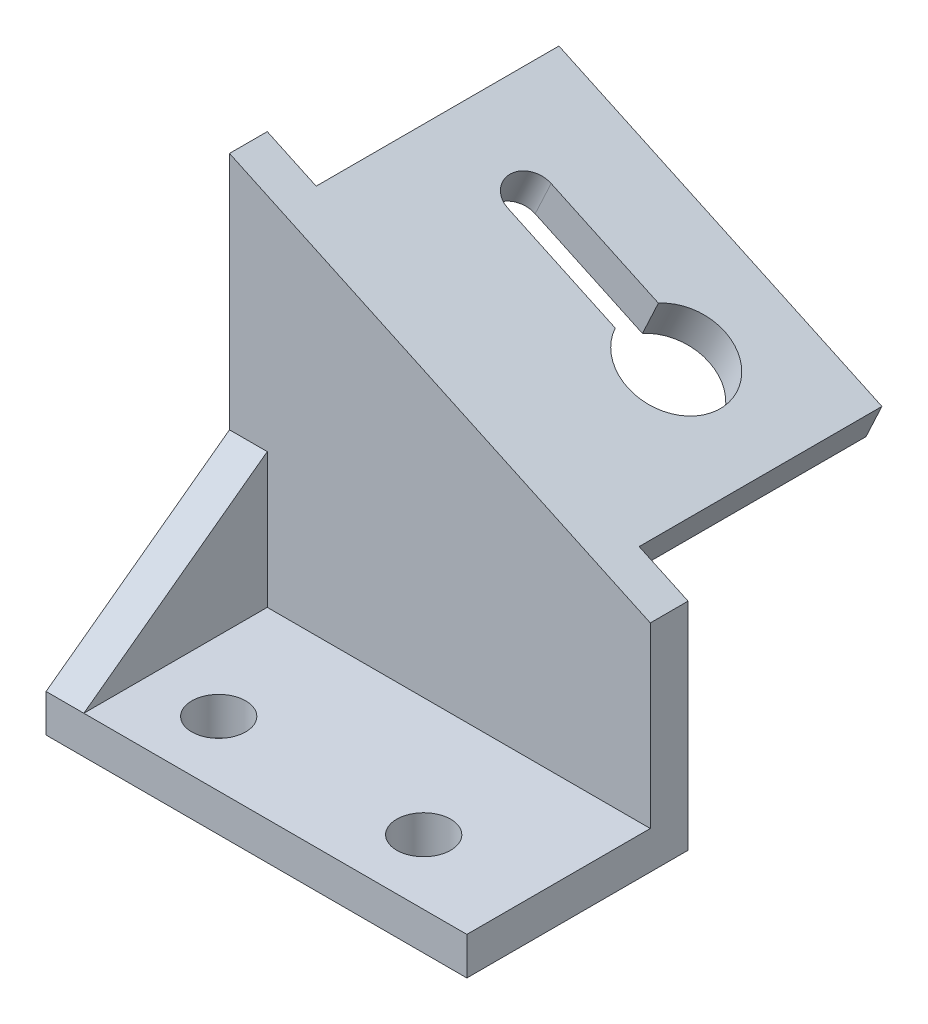
ISO-10303-21;
HEADER;
FILE_DESCRIPTION(('STEP AP214'),'2;1');
FILE_NAME('part.step','',(''),(''),'','','');
FILE_SCHEMA(('AUTOMOTIVE_DESIGN { 1 0 10303 214 1 1 1 1 }'));
ENDSEC;
DATA;
#1=APPLICATION_CONTEXT('core data for automotive mechanical design processes');
#2=APPLICATION_PROTOCOL_DEFINITION('international standard','automotive_design',2000,#1);
#3=PRODUCT_CONTEXT('',#1,'mechanical');
#4=PRODUCT('Part','Part','',(#3));
#5=PRODUCT_RELATED_PRODUCT_CATEGORY('part','',(#4));
#6=PRODUCT_DEFINITION_FORMATION('','',#4);
#7=PRODUCT_DEFINITION_CONTEXT('part definition',#1,'design');
#8=PRODUCT_DEFINITION('design','',#6,#7);
#9=PRODUCT_DEFINITION_SHAPE('','',#8);
#10=(LENGTH_UNIT() NAMED_UNIT(*) SI_UNIT(.MILLI.,.METRE.));
#11=(NAMED_UNIT(*) PLANE_ANGLE_UNIT() SI_UNIT($,.RADIAN.));
#12=(NAMED_UNIT(*) SI_UNIT($,.STERADIAN.) SOLID_ANGLE_UNIT());
#13=UNCERTAINTY_MEASURE_WITH_UNIT(LENGTH_MEASURE(1.E-05),#10,'distance_accuracy_value','');
#14=(GEOMETRIC_REPRESENTATION_CONTEXT(3) GLOBAL_UNCERTAINTY_ASSIGNED_CONTEXT((#13)) GLOBAL_UNIT_ASSIGNED_CONTEXT((#10,
#11,#12)) REPRESENTATION_CONTEXT('',''));
#15=CARTESIAN_POINT('',(0.,0.,0.));
#16=DIRECTION('',(0.,0.,1.));
#17=DIRECTION('',(1.,0.,0.));
#18=AXIS2_PLACEMENT_3D('',#15,#16,#17);
#19=CARTESIAN_POINT('',(0.,7.,-41.));
#20=DIRECTION('',(0.,0.,1.));
#21=DIRECTION('',(1.,0.,0.));
#22=AXIS2_PLACEMENT_3D('',#19,#20,#21);
#23=PLANE('',#22);
#24=DIRECTION('',(0.422618261740693,0.906307787036653,0.));
#25=VECTOR('',#24,1.);
#26=CARTESIAN_POINT('',(6.10475003818169,65.8016602094257,-41.));
#27=LINE('',#26,#25);
#28=CARTESIAN_POINT('',(6.10475003818169,65.8016602094257,-41.));
#29=VERTEX_POINT('',#28);
#30=CARTESIAN_POINT('',(9.06307787036654,72.1458147186823,-41.));
#31=VERTEX_POINT('',#30);
#32=EDGE_CURVE('E229',#29,#31,#27,.T.);
#33=ORIENTED_EDGE('',*,*,#32,.F.);
#34=DIRECTION('',(0.906307787036653,-0.422618261740693,0.));
#35=VECTOR('',#34,1.);
#36=CARTESIAN_POINT('',(6.10475003818169,65.8016602094257,-41.));
#37=LINE('',#36,#35);
#38=CARTESIAN_POINT('',(65.9785942974486,37.8820281081504,-41.));
#39=VERTEX_POINT('',#38);
#40=EDGE_CURVE('E216',#29,#39,#37,.T.);
#41=ORIENTED_EDGE('',*,*,#40,.T.);
#42=DIRECTION('',(0.422618261740693,0.906307787036653,0.));
#43=VECTOR('',#42,1.);
#44=CARTESIAN_POINT('',(65.9785942974486,37.8820281081504,-41.));
#45=LINE('',#44,#43);
#46=CARTESIAN_POINT('',(68.9369221296334,44.2261826174069,-41.));
#47=VERTEX_POINT('',#46);
#48=EDGE_CURVE('E244',#39,#47,#45,.T.);
#49=ORIENTED_EDGE('',*,*,#48,.T.);
#50=DIRECTION('',(0.906307787036653,-0.422618261740693,0.));
#51=VECTOR('',#50,1.);
#52=CARTESIAN_POINT('',(0.,76.3719973360892,-41.));
#53=LINE('',#52,#51);
#54=CARTESIAN_POINT('',(78.,40.,-41.));
#55=VERTEX_POINT('',#54);
#56=EDGE_CURVE('E263',#47,#55,#53,.T.);
#57=ORIENTED_EDGE('',*,*,#56,.T.);
#58=DIRECTION('',(0.,-1.,0.));
#59=VECTOR('',#58,1.);
#60=CARTESIAN_POINT('',(78.,7.,-41.));
#61=LINE('',#60,#59);
#62=CARTESIAN_POINT('',(78.,0.,-41.));
#63=VERTEX_POINT('',#62);
#64=EDGE_CURVE('E333',#55,#63,#61,.T.);
#65=ORIENTED_EDGE('',*,*,#64,.T.);
#66=DIRECTION('',(-1.,0.,0.));
#67=VECTOR('',#66,1.);
#68=CARTESIAN_POINT('',(0.,0.,-41.));
#69=LINE('',#68,#67);
#70=CARTESIAN_POINT('',(0.,0.,-41.));
#71=VERTEX_POINT('',#70);
#72=EDGE_CURVE('E327',#63,#71,#69,.T.);
#73=ORIENTED_EDGE('',*,*,#72,.T.);
#74=DIRECTION('',(0.,-1.,0.));
#75=VECTOR('',#74,1.);
#76=CARTESIAN_POINT('',(0.,7.,-41.));
#77=LINE('',#76,#75);
#78=CARTESIAN_POINT('',(0.,76.3719973360892,-41.));
#79=VERTEX_POINT('',#78);
#80=EDGE_CURVE('E317',#79,#71,#77,.T.);
#81=ORIENTED_EDGE('',*,*,#80,.F.);
#82=EDGE_CURVE('E269',#79,#31,#53,.T.);
#83=ORIENTED_EDGE('',*,*,#82,.T.);
#84=EDGE_LOOP('',(#33,#41,#49,#57,#65,#73,#81,#83));
#85=FACE_BOUND('',#84,.T.);
#86=ADVANCED_FACE('F45',(#85),#23,.F.);
#87=CARTESIAN_POINT('',(0.,0.,-34.));
#88=DIRECTION('',(0.,0.,-1.));
#89=DIRECTION('',(-1.,0.,0.));
#90=AXIS2_PLACEMENT_3D('',#87,#88,#89);
#91=PLANE('',#90);
#92=DIRECTION('',(-1.,0.,0.));
#93=VECTOR('',#92,1.);
#94=CARTESIAN_POINT('',(7.,32.,-34.));
#95=LINE('',#94,#93);
#96=CARTESIAN_POINT('',(7.,32.,-34.));
#97=VERTEX_POINT('',#96);
#98=CARTESIAN_POINT('',(0.,32.,-34.));
#99=VERTEX_POINT('',#98);
#100=EDGE_CURVE('E258',#97,#99,#95,.T.);
#101=ORIENTED_EDGE('',*,*,#100,.F.);
#102=DIRECTION('',(0.,1.,0.));
#103=VECTOR('',#102,1.);
#104=CARTESIAN_POINT('',(7.,7.,-34.));
#105=LINE('',#104,#103);
#106=CARTESIAN_POINT('',(7.,7.,-34.));
#107=VERTEX_POINT('',#106);
#108=EDGE_CURVE('E252',#107,#97,#105,.T.);
#109=ORIENTED_EDGE('',*,*,#108,.F.);
#110=DIRECTION('',(-1.,0.,0.));
#111=VECTOR('',#110,1.);
#112=CARTESIAN_POINT('',(78.,7.,-34.));
#113=LINE('',#112,#111);
#114=CARTESIAN_POINT('',(78.,7.,-34.));
#115=VERTEX_POINT('',#114);
#116=EDGE_CURVE('E268',#115,#107,#113,.T.);
#117=ORIENTED_EDGE('',*,*,#116,.F.);
#118=DIRECTION('',(0.,-1.,0.));
#119=VECTOR('',#118,1.);
#120=CARTESIAN_POINT('',(78.,40.,-34.));
#121=LINE('',#120,#119);
#122=CARTESIAN_POINT('',(78.,40.,-34.));
#123=VERTEX_POINT('',#122);
#124=EDGE_CURVE('E264',#123,#115,#121,.T.);
#125=ORIENTED_EDGE('',*,*,#124,.F.);
#126=DIRECTION('',(0.906307787036653,-0.422618261740693,0.));
#127=VECTOR('',#126,1.);
#128=CARTESIAN_POINT('',(0.,76.3719973360892,-34.));
#129=LINE('',#128,#127);
#130=CARTESIAN_POINT('',(0.,76.3719973360892,-34.));
#131=VERTEX_POINT('',#130);
#132=EDGE_CURVE('E276',#131,#123,#129,.T.);
#133=ORIENTED_EDGE('',*,*,#132,.F.);
#134=DIRECTION('',(0.,1.,0.));
#135=VECTOR('',#134,1.);
#136=CARTESIAN_POINT('',(0.,7.,-34.));
#137=LINE('',#136,#135);
#138=EDGE_CURVE('E273',#99,#131,#137,.T.);
#139=ORIENTED_EDGE('',*,*,#138,.F.);
#140=EDGE_LOOP('',(#101,#109,#117,#125,#133,#139));
#141=FACE_BOUND('',#140,.T.);
#142=ADVANCED_FACE('F385',(#141),#91,.F.);
#143=CARTESIAN_POINT('',(0.,7.,0.));
#144=DIRECTION('',(0.,-1.,0.));
#145=DIRECTION('',(0.,0.,-1.));
#146=AXIS2_PLACEMENT_3D('',#143,#144,#145);
#147=PLANE('',#146);
#148=ORIENTED_EDGE('',*,*,#116,.T.);
#149=DIRECTION('',(0.,0.,-1.));
#150=VECTOR('',#149,1.);
#151=CARTESIAN_POINT('',(7.,7.,0.));
#152=LINE('',#151,#150);
#153=CARTESIAN_POINT('',(7.,7.,0.));
#154=VERTEX_POINT('',#153);
#155=EDGE_CURVE('E249',#154,#107,#152,.T.);
#156=ORIENTED_EDGE('',*,*,#155,.F.);
#157=DIRECTION('',(1.,0.,0.));
#158=VECTOR('',#157,1.);
#159=CARTESIAN_POINT('',(0.,7.,0.));
#160=LINE('',#159,#158);
#161=CARTESIAN_POINT('',(78.,7.,0.));
#162=VERTEX_POINT('',#161);
#163=EDGE_CURVE('E313',#154,#162,#160,.T.);
#164=ORIENTED_EDGE('',*,*,#163,.T.);
#165=DIRECTION('',(0.,0.,-1.));
#166=VECTOR('',#165,1.);
#167=CARTESIAN_POINT('',(78.,7.,0.));
#168=LINE('',#167,#166);
#169=EDGE_CURVE('E312',#162,#115,#168,.T.);
#170=ORIENTED_EDGE('',*,*,#169,.T.);
#171=EDGE_LOOP('',(#148,#156,#164,#170));
#172=FACE_BOUND('',#171,.T.);
#173=CARTESIAN_POINT('',(20.,7.,-12.));
#174=DIRECTION('',(0.,1.,0.));
#175=DIRECTION('',(0.,0.,1.));
#176=AXIS2_PLACEMENT_3D('',#173,#174,#175);
#177=CIRCLE('',#176,5.);
#178=CARTESIAN_POINT('',(20.,7.,-7.));
#179=VERTEX_POINT('',#178);
#180=EDGE_CURVE('E300',#179,#179,#177,.T.);
#181=ORIENTED_EDGE('',*,*,#180,.F.);
#182=EDGE_LOOP('',(#181));
#183=FACE_BOUND('',#182,.T.);
#184=CARTESIAN_POINT('',(58.,7.,-12.));
#185=DIRECTION('',(0.,1.,0.));
#186=DIRECTION('',(0.,0.,1.));
#187=AXIS2_PLACEMENT_3D('',#184,#185,#186);
#188=CIRCLE('',#187,5.);
#189=CARTESIAN_POINT('',(58.,7.,-7.));
#190=VERTEX_POINT('',#189);
#191=EDGE_CURVE('E292',#190,#190,#188,.T.);
#192=ORIENTED_EDGE('',*,*,#191,.F.);
#193=EDGE_LOOP('',(#192));
#194=FACE_BOUND('',#193,.T.);
#195=ADVANCED_FACE('F375',(#172,#183,#194),#147,.F.);
#196=CARTESIAN_POINT('',(0.,0.,0.));
#197=DIRECTION('',(0.,-1.,0.));
#198=DIRECTION('',(0.,0.,-1.));
#199=AXIS2_PLACEMENT_3D('',#196,#197,#198);
#200=PLANE('',#199);
#201=CARTESIAN_POINT('',(20.,0.,-12.));
#202=DIRECTION('',(0.,1.,0.));
#203=DIRECTION('',(0.,0.,1.));
#204=AXIS2_PLACEMENT_3D('',#201,#202,#203);
#205=CIRCLE('',#204,5.);
#206=CARTESIAN_POINT('',(20.,0.,-7.));
#207=VERTEX_POINT('',#206);
#208=EDGE_CURVE('E296',#207,#207,#205,.T.);
#209=ORIENTED_EDGE('',*,*,#208,.T.);
#210=EDGE_LOOP('',(#209));
#211=FACE_BOUND('',#210,.T.);
#212=DIRECTION('',(0.,0.,1.));
#213=VECTOR('',#212,1.);
#214=CARTESIAN_POINT('',(0.,0.,0.));
#215=LINE('',#214,#213);
#216=CARTESIAN_POINT('',(0.,0.,0.));
#217=VERTEX_POINT('',#216);
#218=EDGE_CURVE('E304',#71,#217,#215,.T.);
#219=ORIENTED_EDGE('',*,*,#218,.F.);
#220=ORIENTED_EDGE('',*,*,#72,.F.);
#221=DIRECTION('',(0.,0.,-1.));
#222=VECTOR('',#221,1.);
#223=CARTESIAN_POINT('',(78.,0.,0.));
#224=LINE('',#223,#222);
#225=CARTESIAN_POINT('',(78.,0.,0.));
#226=VERTEX_POINT('',#225);
#227=EDGE_CURVE('E324',#226,#63,#224,.T.);
#228=ORIENTED_EDGE('',*,*,#227,.F.);
#229=DIRECTION('',(1.,0.,0.));
#230=VECTOR('',#229,1.);
#231=CARTESIAN_POINT('',(0.,0.,0.));
#232=LINE('',#231,#230);
#233=EDGE_CURVE('E321',#217,#226,#232,.T.);
#234=ORIENTED_EDGE('',*,*,#233,.F.);
#235=EDGE_LOOP('',(#219,#220,#228,#234));
#236=FACE_BOUND('',#235,.T.);
#237=CARTESIAN_POINT('',(58.,0.,-12.));
#238=DIRECTION('',(0.,1.,0.));
#239=DIRECTION('',(0.,0.,1.));
#240=AXIS2_PLACEMENT_3D('',#237,#238,#239);
#241=CIRCLE('',#240,5.);
#242=CARTESIAN_POINT('',(58.,0.,-7.));
#243=VERTEX_POINT('',#242);
#244=EDGE_CURVE('E288',#243,#243,#241,.T.);
#245=ORIENTED_EDGE('',*,*,#244,.T.);
#246=EDGE_LOOP('',(#245));
#247=FACE_BOUND('',#246,.T.);
#248=ADVANCED_FACE('F349',(#211,#236,#247),#200,.T.);
#249=CARTESIAN_POINT('',(0.,7.,0.));
#250=DIRECTION('',(1.,0.,0.));
#251=DIRECTION('',(0.,0.,-1.));
#252=AXIS2_PLACEMENT_3D('',#249,#250,#251);
#253=PLANE('',#252);
#254=DIRECTION('',(0.,-1.,0.));
#255=VECTOR('',#254,1.);
#256=CARTESIAN_POINT('',(0.,7.,0.));
#257=LINE('',#256,#255);
#258=CARTESIAN_POINT('',(0.,7.,0.));
#259=VERTEX_POINT('',#258);
#260=EDGE_CURVE('E11',#259,#217,#257,.T.);
#261=ORIENTED_EDGE('',*,*,#260,.F.);
#262=DIRECTION('',(0.,-0.592390450477518,0.805651012649425));
#263=VECTOR('',#262,1.);
#264=CARTESIAN_POINT('',(0.,32.,-34.));
#265=LINE('',#264,#263);
#266=EDGE_CURVE('E69',#99,#259,#265,.T.);
#267=ORIENTED_EDGE('',*,*,#266,.F.);
#268=ORIENTED_EDGE('',*,*,#138,.T.);
#269=DIRECTION('',(0.,0.,-1.));
#270=VECTOR('',#269,1.);
#271=CARTESIAN_POINT('',(0.,76.3719973360892,-34.));
#272=LINE('',#271,#270);
#273=EDGE_CURVE('E280',#131,#79,#272,.T.);
#274=ORIENTED_EDGE('',*,*,#273,.T.);
#275=ORIENTED_EDGE('',*,*,#80,.T.);
#276=ORIENTED_EDGE('',*,*,#218,.T.);
#277=EDGE_LOOP('',(#261,#267,#268,#274,#275,#276));
#278=FACE_BOUND('',#277,.T.);
#279=ADVANCED_FACE('F47',(#278),#253,.F.);
#280=CARTESIAN_POINT('',(0.,7.,0.));
#281=DIRECTION('',(0.,0.,-1.));
#282=DIRECTION('',(-1.,0.,0.));
#283=AXIS2_PLACEMENT_3D('',#280,#281,#282);
#284=PLANE('',#283);
#285=ORIENTED_EDGE('',*,*,#233,.T.);
#286=DIRECTION('',(0.,-1.,0.));
#287=VECTOR('',#286,1.);
#288=CARTESIAN_POINT('',(78.,7.,0.));
#289=LINE('',#288,#287);
#290=EDGE_CURVE('E54',#162,#226,#289,.T.);
#291=ORIENTED_EDGE('',*,*,#290,.F.);
#292=ORIENTED_EDGE('',*,*,#163,.F.);
#293=EDGE_CURVE('E308',#259,#154,#160,.T.);
#294=ORIENTED_EDGE('',*,*,#293,.F.);
#295=ORIENTED_EDGE('',*,*,#260,.T.);
#296=EDGE_LOOP('',(#285,#291,#292,#294,#295));
#297=FACE_BOUND('',#296,.T.);
#298=ADVANCED_FACE('F378',(#297),#284,.F.);
#299=CARTESIAN_POINT('',(78.,7.,0.));
#300=DIRECTION('',(-1.,0.,0.));
#301=DIRECTION('',(0.,0.,1.));
#302=AXIS2_PLACEMENT_3D('',#299,#300,#301);
#303=PLANE('',#302);
#304=ORIENTED_EDGE('',*,*,#227,.T.);
#305=ORIENTED_EDGE('',*,*,#64,.F.);
#306=DIRECTION('',(0.,0.,-1.));
#307=VECTOR('',#306,1.);
#308=CARTESIAN_POINT('',(78.,40.,-34.));
#309=LINE('',#308,#307);
#310=EDGE_CURVE('E284',#123,#55,#309,.T.);
#311=ORIENTED_EDGE('',*,*,#310,.F.);
#312=ORIENTED_EDGE('',*,*,#124,.T.);
#313=ORIENTED_EDGE('',*,*,#169,.F.);
#314=ORIENTED_EDGE('',*,*,#290,.T.);
#315=EDGE_LOOP('',(#304,#305,#311,#312,#313,#314));
#316=FACE_BOUND('',#315,.T.);
#317=ADVANCED_FACE('F342',(#316),#303,.F.);
#318=CARTESIAN_POINT('',(20.,7.,-12.));
#319=DIRECTION('',(0.,-1.,0.));
#320=DIRECTION('',(0.,0.,-1.));
#321=AXIS2_PLACEMENT_3D('',#318,#319,#320);
#322=CYLINDRICAL_SURFACE('',#321,5.);
#323=ORIENTED_EDGE('',*,*,#180,.T.);
#324=EDGE_LOOP('',(#323));
#325=FACE_BOUND('',#324,.T.);
#326=ORIENTED_EDGE('',*,*,#208,.F.);
#327=EDGE_LOOP('',(#326));
#328=FACE_BOUND('',#327,.T.);
#329=ADVANCED_FACE('F408',(#325,#328),#322,.F.);
#330=CARTESIAN_POINT('',(58.,7.,-12.));
#331=DIRECTION('',(0.,-1.,0.));
#332=DIRECTION('',(0.,0.,-1.));
#333=AXIS2_PLACEMENT_3D('',#330,#331,#332);
#334=CYLINDRICAL_SURFACE('',#333,5.);
#335=ORIENTED_EDGE('',*,*,#191,.T.);
#336=EDGE_LOOP('',(#335));
#337=FACE_BOUND('',#336,.T.);
#338=ORIENTED_EDGE('',*,*,#244,.F.);
#339=EDGE_LOOP('',(#338));
#340=FACE_BOUND('',#339,.T.);
#341=ADVANCED_FACE('F423',(#337,#340),#334,.F.);
#342=CARTESIAN_POINT('',(0.,76.3719973360892,-34.));
#343=DIRECTION('',(0.422618261740693,0.906307787036653,0.));
#344=DIRECTION('',(-0.906307787036653,0.422618261740693,0.));
#345=AXIS2_PLACEMENT_3D('',#342,#343,#344);
#346=PLANE('',#345);
#347=ORIENTED_EDGE('',*,*,#82,.F.);
#348=ORIENTED_EDGE('',*,*,#273,.F.);
#349=ORIENTED_EDGE('',*,*,#132,.T.);
#350=ORIENTED_EDGE('',*,*,#310,.T.);
#351=ORIENTED_EDGE('',*,*,#56,.F.);
#352=DIRECTION('',(0.,0.,-1.));
#353=VECTOR('',#352,1.);
#354=CARTESIAN_POINT('',(68.9369221296335,44.226182617407,-41.));
#355=LINE('',#354,#353);
#356=CARTESIAN_POINT('',(68.9369221296335,44.226182617407,-86.));
#357=VERTEX_POINT('',#356);
#358=EDGE_CURVE('E61',#47,#357,#355,.T.);
#359=ORIENTED_EDGE('',*,*,#358,.T.);
#360=DIRECTION('',(-0.906307787036653,0.422618261740693,0.));
#361=VECTOR('',#360,1.);
#362=CARTESIAN_POINT('',(9.06307787036654,72.1458147186823,-86.));
#363=LINE('',#362,#361);
#364=CARTESIAN_POINT('',(9.06307787036654,72.1458147186823,-86.));
#365=VERTEX_POINT('',#364);
#366=EDGE_CURVE('E217',#357,#365,#363,.T.);
#367=ORIENTED_EDGE('',*,*,#366,.T.);
#368=DIRECTION('',(0.,0.,1.));
#369=VECTOR('',#368,1.);
#370=CARTESIAN_POINT('',(9.06307787036654,72.1458147186823,-41.));
#371=LINE('',#370,#369);
#372=EDGE_CURVE('E206',#365,#31,#371,.T.);
#373=ORIENTED_EDGE('',*,*,#372,.T.);
#374=EDGE_LOOP('',(#347,#348,#349,#350,#351,#359,#367,#373));
#375=FACE_BOUND('',#374,.T.);
#376=DIRECTION('',(0.906307787036653,-0.422618261740693,0.));
#377=VECTOR('',#376,1.);
#378=CARTESIAN_POINT('',(23.6215327778008,65.3570957044416,-62.));
#379=LINE('',#378,#377);
#380=CARTESIAN_POINT('',(23.6215327778008,65.3570957044416,-62.));
#381=VERTEX_POINT('',#380);
#382=CARTESIAN_POINT('',(43.5038794105208,56.0858052075122,-62.));
#383=VERTEX_POINT('',#382);
#384=EDGE_CURVE('E197',#381,#383,#379,.T.);
#385=ORIENTED_EDGE('',*,*,#384,.F.);
#386=CARTESIAN_POINT('',(23.6215327778008,65.3570957044416,-66.));
#387=DIRECTION('',(0.422618261740693,0.906307787036653,0.));
#388=DIRECTION('',(-0.906307787036653,0.422618261740693,0.));
#389=AXIS2_PLACEMENT_3D('',#386,#387,#388);
#390=CIRCLE('',#389,4.);
#391=CARTESIAN_POINT('',(23.6215327778008,65.3570957044416,-70.));
#392=VERTEX_POINT('',#391);
#393=EDGE_CURVE('E163',#392,#381,#390,.T.);
#394=ORIENTED_EDGE('',*,*,#393,.F.);
#395=DIRECTION('',(-0.906307787036653,0.422618261740693,0.));
#396=VECTOR('',#395,1.);
#397=CARTESIAN_POINT('',(23.6215327778008,65.3570957044416,-70.));
#398=LINE('',#397,#396);
#399=CARTESIAN_POINT('',(43.5038794105208,56.0858052075122,-70.));
#400=VERTEX_POINT('',#399);
#401=EDGE_CURVE('E184',#400,#392,#398,.T.);
#402=ORIENTED_EDGE('',*,*,#401,.F.);
#403=CARTESIAN_POINT('',(50.8107663889004,52.6785478522208,-66.));
#404=DIRECTION('',(0.422618261740693,0.906307787036653,0.));
#405=DIRECTION('',(-0.906307787036653,0.422618261740693,0.));
#406=AXIS2_PLACEMENT_3D('',#403,#404,#405);
#407=CIRCLE('',#406,9.);
#408=EDGE_CURVE('E188',#383,#400,#407,.T.);
#409=ORIENTED_EDGE('',*,*,#408,.F.);
#410=EDGE_LOOP('',(#385,#394,#402,#409));
#411=FACE_BOUND('',#410,.T.);
#412=ADVANCED_FACE('F358',(#375,#411),#346,.T.);
#413=CARTESIAN_POINT('',(7.,32.,-34.));
#414=DIRECTION('',(0.,-0.805651012649425,-0.592390450477518));
#415=DIRECTION('',(0.,0.592390450477518,-0.805651012649425));
#416=AXIS2_PLACEMENT_3D('',#413,#414,#415);
#417=PLANE('',#416);
#418=ORIENTED_EDGE('',*,*,#266,.T.);
#419=ORIENTED_EDGE('',*,*,#293,.T.);
#420=DIRECTION('',(0.,-0.592390450477518,0.805651012649425));
#421=VECTOR('',#420,1.);
#422=CARTESIAN_POINT('',(7.,32.,-34.));
#423=LINE('',#422,#421);
#424=EDGE_CURVE('E255',#97,#154,#423,.T.);
#425=ORIENTED_EDGE('',*,*,#424,.F.);
#426=ORIENTED_EDGE('',*,*,#100,.T.);
#427=EDGE_LOOP('',(#418,#419,#425,#426));
#428=FACE_BOUND('',#427,.T.);
#429=ADVANCED_FACE('F381',(#428),#417,.F.);
#430=CARTESIAN_POINT('',(7.,0.,0.));
#431=DIRECTION('',(1.,0.,0.));
#432=DIRECTION('',(0.,0.,-1.));
#433=AXIS2_PLACEMENT_3D('',#430,#431,#432);
#434=PLANE('',#433);
#435=ORIENTED_EDGE('',*,*,#155,.T.);
#436=ORIENTED_EDGE('',*,*,#108,.T.);
#437=ORIENTED_EDGE('',*,*,#424,.T.);
#438=EDGE_LOOP('',(#435,#436,#437));
#439=FACE_BOUND('',#438,.T.);
#440=ADVANCED_FACE('F388',(#439),#434,.T.);
#441=CARTESIAN_POINT('',(6.10475003818169,65.8016602094257,-41.));
#442=DIRECTION('',(-0.906307787036653,0.422618261740693,0.));
#443=DIRECTION('',(-0.422618261740693,-0.906307787036653,0.));
#444=AXIS2_PLACEMENT_3D('',#441,#442,#443);
#445=PLANE('',#444);
#446=ORIENTED_EDGE('',*,*,#372,.F.);
#447=DIRECTION('',(0.422618261740693,0.906307787036653,0.));
#448=VECTOR('',#447,1.);
#449=CARTESIAN_POINT('',(6.10475003818169,65.8016602094257,-86.));
#450=LINE('',#449,#448);
#451=CARTESIAN_POINT('',(6.10475003818169,65.8016602094257,-86.));
#452=VERTEX_POINT('',#451);
#453=EDGE_CURVE('E238',#452,#365,#450,.T.);
#454=ORIENTED_EDGE('',*,*,#453,.F.);
#455=DIRECTION('',(0.,0.,1.));
#456=VECTOR('',#455,1.);
#457=CARTESIAN_POINT('',(6.10475003818169,65.8016602094257,-41.));
#458=LINE('',#457,#456);
#459=EDGE_CURVE('E212',#452,#29,#458,.T.);
#460=ORIENTED_EDGE('',*,*,#459,.T.);
#461=ORIENTED_EDGE('',*,*,#32,.T.);
#462=EDGE_LOOP('',(#446,#454,#460,#461));
#463=FACE_BOUND('',#462,.T.);
#464=ADVANCED_FACE('F362',(#463),#445,.T.);
#465=CARTESIAN_POINT('',(6.10475003818169,65.8016602094257,-86.));
#466=DIRECTION('',(0.,0.,-1.));
#467=DIRECTION('',(-1.,0.,0.));
#468=AXIS2_PLACEMENT_3D('',#465,#466,#467);
#469=PLANE('',#468);
#470=ORIENTED_EDGE('',*,*,#366,.F.);
#471=DIRECTION('',(0.422618261740693,0.906307787036653,0.));
#472=VECTOR('',#471,1.);
#473=CARTESIAN_POINT('',(65.9785942974486,37.8820281081504,-86.));
#474=LINE('',#473,#472);
#475=CARTESIAN_POINT('',(65.9785942974486,37.8820281081504,-86.));
#476=VERTEX_POINT('',#475);
#477=EDGE_CURVE('E241',#476,#357,#474,.T.);
#478=ORIENTED_EDGE('',*,*,#477,.F.);
#479=DIRECTION('',(-0.906307787036653,0.422618261740693,0.));
#480=VECTOR('',#479,1.);
#481=CARTESIAN_POINT('',(6.10475003818169,65.8016602094257,-86.));
#482=LINE('',#481,#480);
#483=EDGE_CURVE('E225',#476,#452,#482,.T.);
#484=ORIENTED_EDGE('',*,*,#483,.T.);
#485=ORIENTED_EDGE('',*,*,#453,.T.);
#486=EDGE_LOOP('',(#470,#478,#484,#485));
#487=FACE_BOUND('',#486,.T.);
#488=ADVANCED_FACE('F368',(#487),#469,.T.);
#489=CARTESIAN_POINT('',(65.9785942974486,37.8820281081504,-41.));
#490=DIRECTION('',(0.906307787036653,-0.422618261740693,0.));
#491=DIRECTION('',(0.422618261740693,0.906307787036653,0.));
#492=AXIS2_PLACEMENT_3D('',#489,#490,#491);
#493=PLANE('',#492);
#494=ORIENTED_EDGE('',*,*,#358,.F.);
#495=ORIENTED_EDGE('',*,*,#48,.F.);
#496=DIRECTION('',(0.,0.,-1.));
#497=VECTOR('',#496,1.);
#498=CARTESIAN_POINT('',(65.9785942974486,37.8820281081504,-41.));
#499=LINE('',#498,#497);
#500=EDGE_CURVE('E221',#39,#476,#499,.T.);
#501=ORIENTED_EDGE('',*,*,#500,.T.);
#502=ORIENTED_EDGE('',*,*,#477,.T.);
#503=EDGE_LOOP('',(#494,#495,#501,#502));
#504=FACE_BOUND('',#503,.T.);
#505=ADVANCED_FACE('F369',(#504),#493,.T.);
#506=CARTESIAN_POINT('',(26.2938442524191,56.3873309661143,0.));
#507=DIRECTION('',(-0.422618261740693,-0.906307787036653,0.));
#508=DIRECTION('',(0.906307787036653,-0.422618261740693,0.));
#509=AXIS2_PLACEMENT_3D('',#506,#507,#508);
#510=PLANE('',#509);
#511=CARTESIAN_POINT('',(20.663204945616,59.012941195185,-66.));
#512=DIRECTION('',(0.422618261740693,0.906307787036653,0.));
#513=DIRECTION('',(-0.906307787036653,0.422618261740693,0.));
#514=AXIS2_PLACEMENT_3D('',#511,#512,#513);
#515=CIRCLE('',#514,4.);
#516=CARTESIAN_POINT('',(20.663204945616,59.012941195185,-70.));
#517=VERTEX_POINT('',#516);
#518=CARTESIAN_POINT('',(20.663204945616,59.012941195185,-62.));
#519=VERTEX_POINT('',#518);
#520=EDGE_CURVE('E160',#517,#519,#515,.T.);
#521=ORIENTED_EDGE('',*,*,#520,.T.);
#522=DIRECTION('',(0.906307787036653,-0.422618261740693,0.));
#523=VECTOR('',#522,1.);
#524=CARTESIAN_POINT('',(20.663204945616,59.012941195185,-62.));
#525=LINE('',#524,#523);
#526=CARTESIAN_POINT('',(40.545551578336,49.7416506982556,-62.));
#527=VERTEX_POINT('',#526);
#528=EDGE_CURVE('E173',#519,#527,#525,.T.);
#529=ORIENTED_EDGE('',*,*,#528,.T.);
#530=CARTESIAN_POINT('',(47.8524385567156,46.3343933429643,-66.));
#531=DIRECTION('',(0.422618261740693,0.906307787036653,0.));
#532=DIRECTION('',(-0.906307787036653,0.422618261740693,0.));
#533=AXIS2_PLACEMENT_3D('',#530,#531,#532);
#534=CIRCLE('',#533,9.);
#535=CARTESIAN_POINT('',(40.545551578336,49.7416506982556,-70.));
#536=VERTEX_POINT('',#535);
#537=EDGE_CURVE('E178',#527,#536,#534,.T.);
#538=ORIENTED_EDGE('',*,*,#537,.T.);
#539=DIRECTION('',(-0.906307787036653,0.422618261740693,0.));
#540=VECTOR('',#539,1.);
#541=CARTESIAN_POINT('',(20.663204945616,59.012941195185,-70.));
#542=LINE('',#541,#540);
#543=EDGE_CURVE('E169',#536,#517,#542,.T.);
#544=ORIENTED_EDGE('',*,*,#543,.T.);
#545=EDGE_LOOP('',(#521,#529,#538,#544));
#546=FACE_BOUND('',#545,.T.);
#547=ORIENTED_EDGE('',*,*,#459,.F.);
#548=ORIENTED_EDGE('',*,*,#483,.F.);
#549=ORIENTED_EDGE('',*,*,#500,.F.);
#550=ORIENTED_EDGE('',*,*,#40,.F.);
#551=EDGE_LOOP('',(#547,#548,#549,#550));
#552=FACE_BOUND('',#551,.T.);
#553=ADVANCED_FACE('F180',(#546,#552),#510,.T.);
#554=CARTESIAN_POINT('',(20.663204945616,59.012941195185,-66.));
#555=DIRECTION('',(0.422618261740693,0.906307787036653,0.));
#556=DIRECTION('',(-0.906307787036653,0.422618261740693,0.));
#557=AXIS2_PLACEMENT_3D('',#554,#555,#556);
#558=CYLINDRICAL_SURFACE('',#557,4.);
#559=ORIENTED_EDGE('',*,*,#393,.T.);
#560=DIRECTION('',(0.422618261740693,0.906307787036653,0.));
#561=VECTOR('',#560,1.);
#562=CARTESIAN_POINT('',(20.663204945616,59.012941195185,-62.));
#563=LINE('',#562,#561);
#564=EDGE_CURVE('E156',#519,#381,#563,.T.);
#565=ORIENTED_EDGE('',*,*,#564,.F.);
#566=ORIENTED_EDGE('',*,*,#520,.F.);
#567=DIRECTION('',(0.422618261740693,0.906307787036653,0.));
#568=VECTOR('',#567,1.);
#569=CARTESIAN_POINT('',(20.663204945616,59.012941195185,-70.));
#570=LINE('',#569,#568);
#571=EDGE_CURVE('E203',#517,#392,#570,.T.);
#572=ORIENTED_EDGE('',*,*,#571,.T.);
#573=EDGE_LOOP('',(#559,#565,#566,#572));
#574=FACE_BOUND('',#573,.T.);
#575=ADVANCED_FACE('F158',(#574),#558,.F.);
#576=CARTESIAN_POINT('',(20.663204945616,59.012941195185,-70.));
#577=DIRECTION('',(0.,0.,-1.));
#578=DIRECTION('',(-1.,0.,0.));
#579=AXIS2_PLACEMENT_3D('',#576,#577,#578);
#580=PLANE('',#579);
#581=ORIENTED_EDGE('',*,*,#401,.T.);
#582=ORIENTED_EDGE('',*,*,#571,.F.);
#583=ORIENTED_EDGE('',*,*,#543,.F.);
#584=DIRECTION('',(0.422618261740693,0.906307787036653,0.));
#585=VECTOR('',#584,1.);
#586=CARTESIAN_POINT('',(40.545551578336,49.7416506982556,-70.));
#587=LINE('',#586,#585);
#588=EDGE_CURVE('E207',#536,#400,#587,.T.);
#589=ORIENTED_EDGE('',*,*,#588,.T.);
#590=EDGE_LOOP('',(#581,#582,#583,#589));
#591=FACE_BOUND('',#590,.T.);
#592=ADVANCED_FACE('F468',(#591),#580,.F.);
#593=CARTESIAN_POINT('',(47.8524385567156,46.3343933429643,-66.));
#594=DIRECTION('',(0.422618261740693,0.906307787036653,0.));
#595=DIRECTION('',(-0.906307787036653,0.422618261740693,0.));
#596=AXIS2_PLACEMENT_3D('',#593,#594,#595);
#597=CYLINDRICAL_SURFACE('',#596,9.);
#598=ORIENTED_EDGE('',*,*,#408,.T.);
#599=ORIENTED_EDGE('',*,*,#588,.F.);
#600=ORIENTED_EDGE('',*,*,#537,.F.);
#601=DIRECTION('',(0.422618261740693,0.906307787036653,0.));
#602=VECTOR('',#601,1.);
#603=CARTESIAN_POINT('',(40.545551578336,49.7416506982556,-62.));
#604=LINE('',#603,#602);
#605=EDGE_CURVE('E168',#527,#383,#604,.T.);
#606=ORIENTED_EDGE('',*,*,#605,.T.);
#607=EDGE_LOOP('',(#598,#599,#600,#606));
#608=FACE_BOUND('',#607,.T.);
#609=ADVANCED_FACE('F476',(#608),#597,.F.);
#610=CARTESIAN_POINT('',(20.663204945616,59.012941195185,-62.));
#611=DIRECTION('',(0.,0.,1.));
#612=DIRECTION('',(1.,0.,0.));
#613=AXIS2_PLACEMENT_3D('',#610,#611,#612);
#614=PLANE('',#613);
#615=ORIENTED_EDGE('',*,*,#384,.T.);
#616=ORIENTED_EDGE('',*,*,#605,.F.);
#617=ORIENTED_EDGE('',*,*,#528,.F.);
#618=ORIENTED_EDGE('',*,*,#564,.T.);
#619=EDGE_LOOP('',(#615,#616,#617,#618));
#620=FACE_BOUND('',#619,.T.);
#621=ADVANCED_FACE('F174',(#620),#614,.F.);
#622=CLOSED_SHELL('',(#86,#142,#195,#248,#279,#298,#317,#329,#341,#412,#429,#440,#464,#488,#505,
#553,#575,#592,#609,#621));
#623=MANIFOLD_SOLID_BREP('B2',#622);
#624=ADVANCED_BREP_SHAPE_REPRESENTATION('',(#18,#623),#14);
#625=SHAPE_DEFINITION_REPRESENTATION(#9,#624);
ENDSEC;
END-ISO-10303-21;
